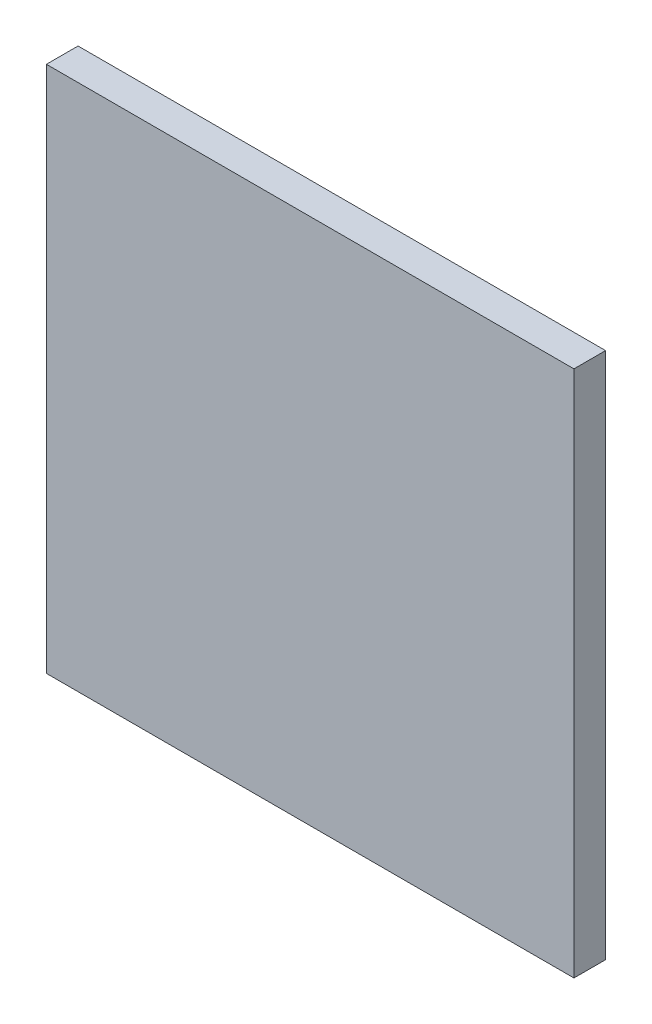
ISO-10303-21;
HEADER;
FILE_DESCRIPTION(('STEP AP214'),'2;1');
FILE_NAME('part.step','',(''),(''),'','','');
FILE_SCHEMA(('AUTOMOTIVE_DESIGN { 1 0 10303 214 1 1 1 1 }'));
ENDSEC;
DATA;
#1=APPLICATION_CONTEXT('core data for automotive mechanical design processes');
#2=APPLICATION_PROTOCOL_DEFINITION('international standard','automotive_design',2000,#1);
#3=PRODUCT_CONTEXT('',#1,'mechanical');
#4=PRODUCT('Part','Part','',(#3));
#5=PRODUCT_RELATED_PRODUCT_CATEGORY('part','',(#4));
#6=PRODUCT_DEFINITION_FORMATION('','',#4);
#7=PRODUCT_DEFINITION_CONTEXT('part definition',#1,'design');
#8=PRODUCT_DEFINITION('design','',#6,#7);
#9=PRODUCT_DEFINITION_SHAPE('','',#8);
#10=(LENGTH_UNIT() NAMED_UNIT(*) SI_UNIT(.MILLI.,.METRE.));
#11=(NAMED_UNIT(*) PLANE_ANGLE_UNIT() SI_UNIT($,.RADIAN.));
#12=(NAMED_UNIT(*) SI_UNIT($,.STERADIAN.) SOLID_ANGLE_UNIT());
#13=UNCERTAINTY_MEASURE_WITH_UNIT(LENGTH_MEASURE(1.E-05),#10,'distance_accuracy_value','');
#14=(GEOMETRIC_REPRESENTATION_CONTEXT(3) GLOBAL_UNCERTAINTY_ASSIGNED_CONTEXT((#13)) GLOBAL_UNIT_ASSIGNED_CONTEXT((#10,
#11,#12)) REPRESENTATION_CONTEXT('',''));
#15=CARTESIAN_POINT('',(0.,0.,0.));
#16=DIRECTION('',(0.,0.,1.));
#17=DIRECTION('',(1.,0.,0.));
#18=AXIS2_PLACEMENT_3D('',#15,#16,#17);
#19=CARTESIAN_POINT('',(0.,0.,3.));
#20=DIRECTION('',(1.,0.,0.));
#21=DIRECTION('',(0.,1.,0.));
#22=AXIS2_PLACEMENT_3D('',#19,#20,#21);
#23=PLANE('',#22);
#24=DIRECTION('',(0.,-1.,0.));
#25=VECTOR('',#24,1.);
#26=CARTESIAN_POINT('',(0.,0.,0.));
#27=LINE('',#26,#25);
#28=CARTESIAN_POINT('',(0.,50.,0.));
#29=VERTEX_POINT('',#28);
#30=CARTESIAN_POINT('',(0.,0.,0.));
#31=VERTEX_POINT('',#30);
#32=EDGE_CURVE('E97',#29,#31,#27,.T.);
#33=ORIENTED_EDGE('',*,*,#32,.T.);
#34=DIRECTION('',(0.,0.,-1.));
#35=VECTOR('',#34,1.);
#36=CARTESIAN_POINT('',(0.,0.,3.));
#37=LINE('',#36,#35);
#38=CARTESIAN_POINT('',(0.,0.,3.));
#39=VERTEX_POINT('',#38);
#40=EDGE_CURVE('E11',#39,#31,#37,.T.);
#41=ORIENTED_EDGE('',*,*,#40,.F.);
#42=DIRECTION('',(0.,-1.,0.));
#43=VECTOR('',#42,1.);
#44=CARTESIAN_POINT('',(0.,0.,3.));
#45=LINE('',#44,#43);
#46=CARTESIAN_POINT('',(0.,50.,3.));
#47=VERTEX_POINT('',#46);
#48=EDGE_CURVE('E85',#47,#39,#45,.T.);
#49=ORIENTED_EDGE('',*,*,#48,.F.);
#50=DIRECTION('',(0.,0.,-1.));
#51=VECTOR('',#50,1.);
#52=CARTESIAN_POINT('',(0.,50.,3.));
#53=LINE('',#52,#51);
#54=EDGE_CURVE('E93',#47,#29,#53,.T.);
#55=ORIENTED_EDGE('',*,*,#54,.T.);
#56=EDGE_LOOP('',(#33,#41,#49,#55));
#57=FACE_BOUND('',#56,.T.);
#58=ADVANCED_FACE('F34',(#57),#23,.F.);
#59=CARTESIAN_POINT('',(0.,0.,3.));
#60=DIRECTION('',(0.,1.,0.));
#61=DIRECTION('',(0.,0.,1.));
#62=AXIS2_PLACEMENT_3D('',#59,#60,#61);
#63=PLANE('',#62);
#64=DIRECTION('',(1.,0.,0.));
#65=VECTOR('',#64,1.);
#66=CARTESIAN_POINT('',(0.,0.,0.));
#67=LINE('',#66,#65);
#68=CARTESIAN_POINT('',(50.,0.,0.));
#69=VERTEX_POINT('',#68);
#70=EDGE_CURVE('E89',#31,#69,#67,.T.);
#71=ORIENTED_EDGE('',*,*,#70,.T.);
#72=DIRECTION('',(0.,0.,-1.));
#73=VECTOR('',#72,1.);
#74=CARTESIAN_POINT('',(50.,0.,3.));
#75=LINE('',#74,#73);
#76=CARTESIAN_POINT('',(50.,0.,3.));
#77=VERTEX_POINT('',#76);
#78=EDGE_CURVE('E42',#77,#69,#75,.T.);
#79=ORIENTED_EDGE('',*,*,#78,.F.);
#80=DIRECTION('',(1.,0.,0.));
#81=VECTOR('',#80,1.);
#82=CARTESIAN_POINT('',(0.,0.,3.));
#83=LINE('',#82,#81);
#84=EDGE_CURVE('E80',#39,#77,#83,.T.);
#85=ORIENTED_EDGE('',*,*,#84,.F.);
#86=ORIENTED_EDGE('',*,*,#40,.T.);
#87=EDGE_LOOP('',(#71,#79,#85,#86));
#88=FACE_BOUND('',#87,.T.);
#89=ADVANCED_FACE('F88',(#88),#63,.F.);
#90=CARTESIAN_POINT('',(50.,0.,3.));
#91=DIRECTION('',(-1.,0.,0.));
#92=DIRECTION('',(0.,-1.,0.));
#93=AXIS2_PLACEMENT_3D('',#90,#91,#92);
#94=PLANE('',#93);
#95=DIRECTION('',(0.,1.,0.));
#96=VECTOR('',#95,1.);
#97=CARTESIAN_POINT('',(50.,0.,0.));
#98=LINE('',#97,#96);
#99=CARTESIAN_POINT('',(50.,50.,0.));
#100=VERTEX_POINT('',#99);
#101=EDGE_CURVE('E67',#69,#100,#98,.T.);
#102=ORIENTED_EDGE('',*,*,#101,.T.);
#103=DIRECTION('',(0.,0.,-1.));
#104=VECTOR('',#103,1.);
#105=CARTESIAN_POINT('',(50.,50.,3.));
#106=LINE('',#105,#104);
#107=CARTESIAN_POINT('',(50.,50.,3.));
#108=VERTEX_POINT('',#107);
#109=EDGE_CURVE('E90',#108,#100,#106,.T.);
#110=ORIENTED_EDGE('',*,*,#109,.F.);
#111=DIRECTION('',(0.,1.,0.));
#112=VECTOR('',#111,1.);
#113=CARTESIAN_POINT('',(50.,0.,3.));
#114=LINE('',#113,#112);
#115=EDGE_CURVE('E83',#77,#108,#114,.T.);
#116=ORIENTED_EDGE('',*,*,#115,.F.);
#117=ORIENTED_EDGE('',*,*,#78,.T.);
#118=EDGE_LOOP('',(#102,#110,#116,#117));
#119=FACE_BOUND('',#118,.T.);
#120=ADVANCED_FACE('F91',(#119),#94,.F.);
#121=CARTESIAN_POINT('',(0.,50.,3.));
#122=DIRECTION('',(0.,-1.,0.));
#123=DIRECTION('',(0.,0.,-1.));
#124=AXIS2_PLACEMENT_3D('',#121,#122,#123);
#125=PLANE('',#124);
#126=DIRECTION('',(-1.,0.,0.));
#127=VECTOR('',#126,1.);
#128=CARTESIAN_POINT('',(0.,50.,0.));
#129=LINE('',#128,#127);
#130=EDGE_CURVE('E73',#100,#29,#129,.T.);
#131=ORIENTED_EDGE('',*,*,#130,.T.);
#132=ORIENTED_EDGE('',*,*,#54,.F.);
#133=DIRECTION('',(-1.,0.,0.));
#134=VECTOR('',#133,1.);
#135=CARTESIAN_POINT('',(0.,50.,3.));
#136=LINE('',#135,#134);
#137=EDGE_CURVE('E50',#108,#47,#136,.T.);
#138=ORIENTED_EDGE('',*,*,#137,.F.);
#139=ORIENTED_EDGE('',*,*,#109,.T.);
#140=EDGE_LOOP('',(#131,#132,#138,#139));
#141=FACE_BOUND('',#140,.T.);
#142=ADVANCED_FACE('F104',(#141),#125,.F.);
#143=CARTESIAN_POINT('',(0.,0.,3.));
#144=DIRECTION('',(0.,0.,-1.));
#145=DIRECTION('',(-1.,0.,0.));
#146=AXIS2_PLACEMENT_3D('',#143,#144,#145);
#147=PLANE('',#146);
#148=ORIENTED_EDGE('',*,*,#48,.T.);
#149=ORIENTED_EDGE('',*,*,#84,.T.);
#150=ORIENTED_EDGE('',*,*,#115,.T.);
#151=ORIENTED_EDGE('',*,*,#137,.T.);
#152=EDGE_LOOP('',(#148,#149,#150,#151));
#153=FACE_BOUND('',#152,.T.);
#154=ADVANCED_FACE('F81',(#153),#147,.F.);
#155=CARTESIAN_POINT('',(0.,0.,0.));
#156=DIRECTION('',(0.,0.,-1.));
#157=DIRECTION('',(-1.,0.,0.));
#158=AXIS2_PLACEMENT_3D('',#155,#156,#157);
#159=PLANE('',#158);
#160=ORIENTED_EDGE('',*,*,#32,.F.);
#161=ORIENTED_EDGE('',*,*,#130,.F.);
#162=ORIENTED_EDGE('',*,*,#101,.F.);
#163=ORIENTED_EDGE('',*,*,#70,.F.);
#164=EDGE_LOOP('',(#160,#161,#162,#163));
#165=FACE_BOUND('',#164,.T.);
#166=ADVANCED_FACE('F107',(#165),#159,.T.);
#167=CLOSED_SHELL('',(#58,#89,#120,#142,#154,#166));
#168=MANIFOLD_SOLID_BREP('B2',#167);
#169=ADVANCED_BREP_SHAPE_REPRESENTATION('',(#18,#168),#14);
#170=SHAPE_DEFINITION_REPRESENTATION(#9,#169);
ENDSEC;
END-ISO-10303-21;
